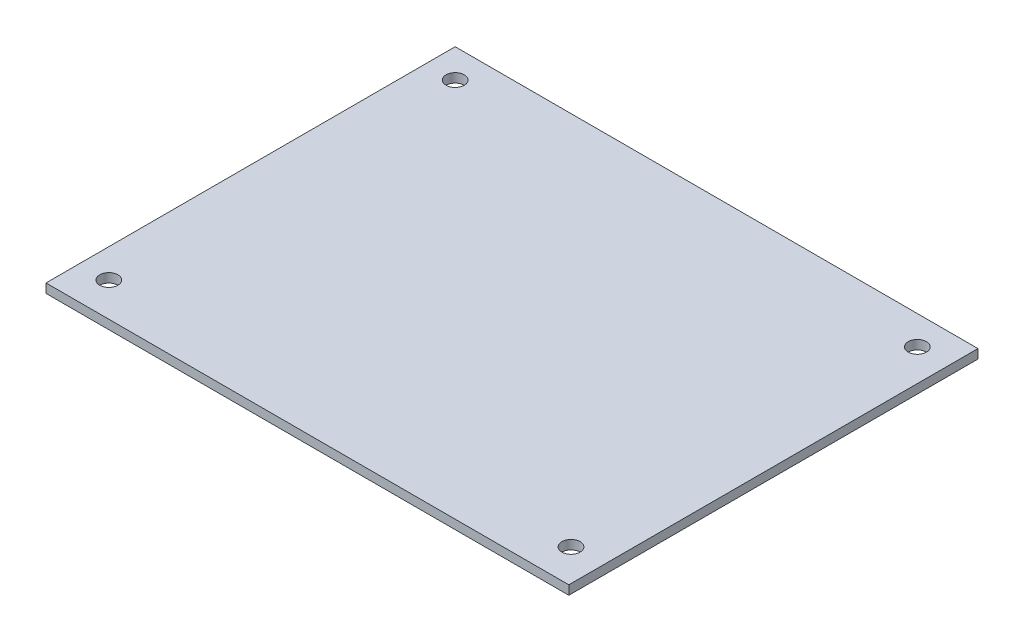
ISO-10303-21;
HEADER;
FILE_DESCRIPTION(('STEP AP214'),'2;1');
FILE_NAME('part.step','',(''),(''),'','','');
FILE_SCHEMA(('AUTOMOTIVE_DESIGN { 1 0 10303 214 1 1 1 1 }'));
ENDSEC;
DATA;
#1=APPLICATION_CONTEXT('core data for automotive mechanical design processes');
#2=APPLICATION_PROTOCOL_DEFINITION('international standard','automotive_design',2000,#1);
#3=PRODUCT_CONTEXT('',#1,'mechanical');
#4=PRODUCT('Part','Part','',(#3));
#5=PRODUCT_RELATED_PRODUCT_CATEGORY('part','',(#4));
#6=PRODUCT_DEFINITION_FORMATION('','',#4);
#7=PRODUCT_DEFINITION_CONTEXT('part definition',#1,'design');
#8=PRODUCT_DEFINITION('design','',#6,#7);
#9=PRODUCT_DEFINITION_SHAPE('','',#8);
#10=(LENGTH_UNIT() NAMED_UNIT(*) SI_UNIT(.MILLI.,.METRE.));
#11=(NAMED_UNIT(*) PLANE_ANGLE_UNIT() SI_UNIT($,.RADIAN.));
#12=(NAMED_UNIT(*) SI_UNIT($,.STERADIAN.) SOLID_ANGLE_UNIT());
#13=UNCERTAINTY_MEASURE_WITH_UNIT(LENGTH_MEASURE(1.E-05),#10,'distance_accuracy_value','');
#14=(GEOMETRIC_REPRESENTATION_CONTEXT(3) GLOBAL_UNCERTAINTY_ASSIGNED_CONTEXT((#13)) GLOBAL_UNIT_ASSIGNED_CONTEXT((#10,
#11,#12)) REPRESENTATION_CONTEXT('',''));
#15=CARTESIAN_POINT('',(0.,0.,0.));
#16=DIRECTION('',(0.,0.,1.));
#17=DIRECTION('',(1.,0.,0.));
#18=AXIS2_PLACEMENT_3D('',#15,#16,#17);
#19=CARTESIAN_POINT('',(0.,1.6,0.));
#20=DIRECTION('',(0.,-1.,0.));
#21=DIRECTION('',(0.,0.,-1.));
#22=AXIS2_PLACEMENT_3D('',#19,#20,#21);
#23=PLANE('',#22);
#24=DIRECTION('',(0.,0.,1.));
#25=VECTOR('',#24,1.);
#26=CARTESIAN_POINT('',(0.,1.6,0.));
#27=LINE('',#26,#25);
#28=CARTESIAN_POINT('',(0.,1.6,-72.));
#29=VERTEX_POINT('',#28);
#30=CARTESIAN_POINT('',(0.,1.6,0.));
#31=VERTEX_POINT('',#30);
#32=EDGE_CURVE('E84',#29,#31,#27,.T.);
#33=ORIENTED_EDGE('',*,*,#32,.T.);
#34=DIRECTION('',(1.,0.,0.));
#35=VECTOR('',#34,1.);
#36=CARTESIAN_POINT('',(0.,1.6,0.));
#37=LINE('',#36,#35);
#38=CARTESIAN_POINT('',(92.,1.6,0.));
#39=VERTEX_POINT('',#38);
#40=EDGE_CURVE('E79',#31,#39,#37,.T.);
#41=ORIENTED_EDGE('',*,*,#40,.T.);
#42=DIRECTION('',(0.,0.,-1.));
#43=VECTOR('',#42,1.);
#44=CARTESIAN_POINT('',(92.,1.6,0.));
#45=LINE('',#44,#43);
#46=CARTESIAN_POINT('',(92.,1.6,-72.));
#47=VERTEX_POINT('',#46);
#48=EDGE_CURVE('E82',#39,#47,#45,.T.);
#49=ORIENTED_EDGE('',*,*,#48,.T.);
#50=DIRECTION('',(-1.,0.,0.));
#51=VECTOR('',#50,1.);
#52=CARTESIAN_POINT('',(0.,1.6,-72.));
#53=LINE('',#52,#51);
#54=EDGE_CURVE('E49',#47,#29,#53,.T.);
#55=ORIENTED_EDGE('',*,*,#54,.T.);
#56=EDGE_LOOP('',(#33,#41,#49,#55));
#57=FACE_BOUND('',#56,.T.);
#58=CARTESIAN_POINT('',(5.08,1.6,-66.92));
#59=DIRECTION('',(0.,1.,0.));
#60=DIRECTION('',(0.,0.,1.));
#61=AXIS2_PLACEMENT_3D('',#58,#59,#60);
#62=CIRCLE('',#61,1.6);
#63=CARTESIAN_POINT('',(5.08,1.6,-65.32));
#64=VERTEX_POINT('',#63);
#65=EDGE_CURVE('E99',#64,#64,#62,.T.);
#66=ORIENTED_EDGE('',*,*,#65,.F.);
#67=EDGE_LOOP('',(#66));
#68=FACE_BOUND('',#67,.T.);
#69=CARTESIAN_POINT('',(86.412,1.6,-66.92));
#70=DIRECTION('',(0.,1.,0.));
#71=DIRECTION('',(0.,0.,1.));
#72=AXIS2_PLACEMENT_3D('',#69,#70,#71);
#73=CIRCLE('',#72,1.60000000000001);
#74=CARTESIAN_POINT('',(86.412,1.6,-65.32));
#75=VERTEX_POINT('',#74);
#76=EDGE_CURVE('E114',#75,#75,#73,.T.);
#77=ORIENTED_EDGE('',*,*,#76,.F.);
#78=EDGE_LOOP('',(#77));
#79=FACE_BOUND('',#78,.T.);
#80=CARTESIAN_POINT('',(86.412,1.6,-5.969));
#81=DIRECTION('',(0.,1.,0.));
#82=DIRECTION('',(0.,0.,1.));
#83=AXIS2_PLACEMENT_3D('',#80,#81,#82);
#84=CIRCLE('',#83,1.60000000000001);
#85=CARTESIAN_POINT('',(86.412,1.6,-4.369));
#86=VERTEX_POINT('',#85);
#87=EDGE_CURVE('E120',#86,#86,#84,.T.);
#88=ORIENTED_EDGE('',*,*,#87,.F.);
#89=EDGE_LOOP('',(#88));
#90=FACE_BOUND('',#89,.T.);
#91=CARTESIAN_POINT('',(5.08,1.6,-5.969));
#92=DIRECTION('',(0.,1.,0.));
#93=DIRECTION('',(0.,0.,1.));
#94=AXIS2_PLACEMENT_3D('',#91,#92,#93);
#95=CIRCLE('',#94,1.6);
#96=CARTESIAN_POINT('',(5.08,1.6,-4.369));
#97=VERTEX_POINT('',#96);
#98=EDGE_CURVE('E126',#97,#97,#95,.T.);
#99=ORIENTED_EDGE('',*,*,#98,.F.);
#100=EDGE_LOOP('',(#99));
#101=FACE_BOUND('',#100,.T.);
#102=ADVANCED_FACE('F32',(#57,#68,#79,#90,#101),#23,.F.);
#103=CARTESIAN_POINT('',(0.,0.,0.));
#104=DIRECTION('',(0.,-1.,0.));
#105=DIRECTION('',(0.,0.,-1.));
#106=AXIS2_PLACEMENT_3D('',#103,#104,#105);
#107=PLANE('',#106);
#108=CARTESIAN_POINT('',(86.412,0.,-5.969));
#109=DIRECTION('',(0.,1.,0.));
#110=DIRECTION('',(0.,0.,1.));
#111=AXIS2_PLACEMENT_3D('',#108,#109,#110);
#112=CIRCLE('',#111,1.60000000000001);
#113=CARTESIAN_POINT('',(86.412,0.,-4.369));
#114=VERTEX_POINT('',#113);
#115=EDGE_CURVE('E123',#114,#114,#112,.T.);
#116=ORIENTED_EDGE('',*,*,#115,.T.);
#117=EDGE_LOOP('',(#116));
#118=FACE_BOUND('',#117,.T.);
#119=CARTESIAN_POINT('',(5.08,0.,-66.92));
#120=DIRECTION('',(0.,1.,0.));
#121=DIRECTION('',(0.,0.,1.));
#122=AXIS2_PLACEMENT_3D('',#119,#120,#121);
#123=CIRCLE('',#122,1.6);
#124=CARTESIAN_POINT('',(5.08,0.,-65.32));
#125=VERTEX_POINT('',#124);
#126=EDGE_CURVE('E111',#125,#125,#123,.T.);
#127=ORIENTED_EDGE('',*,*,#126,.T.);
#128=EDGE_LOOP('',(#127));
#129=FACE_BOUND('',#128,.T.);
#130=DIRECTION('',(0.,0.,1.));
#131=VECTOR('',#130,1.);
#132=CARTESIAN_POINT('',(0.,0.,0.));
#133=LINE('',#132,#131);
#134=CARTESIAN_POINT('',(0.,0.,-72.));
#135=VERTEX_POINT('',#134);
#136=CARTESIAN_POINT('',(0.,0.,0.));
#137=VERTEX_POINT('',#136);
#138=EDGE_CURVE('E96',#135,#137,#133,.T.);
#139=ORIENTED_EDGE('',*,*,#138,.F.);
#140=DIRECTION('',(-1.,0.,0.));
#141=VECTOR('',#140,1.);
#142=CARTESIAN_POINT('',(0.,0.,-72.));
#143=LINE('',#142,#141);
#144=CARTESIAN_POINT('',(92.,0.,-72.));
#145=VERTEX_POINT('',#144);
#146=EDGE_CURVE('E72',#145,#135,#143,.T.);
#147=ORIENTED_EDGE('',*,*,#146,.F.);
#148=DIRECTION('',(0.,0.,-1.));
#149=VECTOR('',#148,1.);
#150=CARTESIAN_POINT('',(92.,0.,0.));
#151=LINE('',#150,#149);
#152=CARTESIAN_POINT('',(92.,0.,0.));
#153=VERTEX_POINT('',#152);
#154=EDGE_CURVE('E66',#153,#145,#151,.T.);
#155=ORIENTED_EDGE('',*,*,#154,.F.);
#156=DIRECTION('',(1.,0.,0.));
#157=VECTOR('',#156,1.);
#158=CARTESIAN_POINT('',(0.,0.,0.));
#159=LINE('',#158,#157);
#160=EDGE_CURVE('E88',#137,#153,#159,.T.);
#161=ORIENTED_EDGE('',*,*,#160,.F.);
#162=EDGE_LOOP('',(#139,#147,#155,#161));
#163=FACE_BOUND('',#162,.T.);
#164=CARTESIAN_POINT('',(86.412,0.,-66.92));
#165=DIRECTION('',(0.,1.,0.));
#166=DIRECTION('',(0.,0.,1.));
#167=AXIS2_PLACEMENT_3D('',#164,#165,#166);
#168=CIRCLE('',#167,1.60000000000001);
#169=CARTESIAN_POINT('',(86.412,0.,-65.32));
#170=VERTEX_POINT('',#169);
#171=EDGE_CURVE('E117',#170,#170,#168,.T.);
#172=ORIENTED_EDGE('',*,*,#171,.T.);
#173=EDGE_LOOP('',(#172));
#174=FACE_BOUND('',#173,.T.);
#175=CARTESIAN_POINT('',(5.08,0.,-5.969));
#176=DIRECTION('',(0.,1.,0.));
#177=DIRECTION('',(0.,0.,1.));
#178=AXIS2_PLACEMENT_3D('',#175,#176,#177);
#179=CIRCLE('',#178,1.6);
#180=CARTESIAN_POINT('',(5.08,0.,-4.369));
#181=VERTEX_POINT('',#180);
#182=EDGE_CURVE('E129',#181,#181,#179,.T.);
#183=ORIENTED_EDGE('',*,*,#182,.T.);
#184=EDGE_LOOP('',(#183));
#185=FACE_BOUND('',#184,.T.);
#186=ADVANCED_FACE('F107',(#118,#129,#163,#174,#185),#107,.T.);
#187=CARTESIAN_POINT('',(0.,1.6,0.));
#188=DIRECTION('',(1.,0.,0.));
#189=DIRECTION('',(0.,0.,-1.));
#190=AXIS2_PLACEMENT_3D('',#187,#188,#189);
#191=PLANE('',#190);
#192=ORIENTED_EDGE('',*,*,#138,.T.);
#193=DIRECTION('',(0.,-1.,0.));
#194=VECTOR('',#193,1.);
#195=CARTESIAN_POINT('',(0.,1.6,0.));
#196=LINE('',#195,#194);
#197=EDGE_CURVE('E11',#31,#137,#196,.T.);
#198=ORIENTED_EDGE('',*,*,#197,.F.);
#199=ORIENTED_EDGE('',*,*,#32,.F.);
#200=DIRECTION('',(0.,-1.,0.));
#201=VECTOR('',#200,1.);
#202=CARTESIAN_POINT('',(0.,1.6,-72.));
#203=LINE('',#202,#201);
#204=EDGE_CURVE('E92',#29,#135,#203,.T.);
#205=ORIENTED_EDGE('',*,*,#204,.T.);
#206=EDGE_LOOP('',(#192,#198,#199,#205));
#207=FACE_BOUND('',#206,.T.);
#208=ADVANCED_FACE('F34',(#207),#191,.F.);
#209=CARTESIAN_POINT('',(0.,1.6,0.));
#210=DIRECTION('',(0.,0.,-1.));
#211=DIRECTION('',(-1.,0.,0.));
#212=AXIS2_PLACEMENT_3D('',#209,#210,#211);
#213=PLANE('',#212);
#214=ORIENTED_EDGE('',*,*,#160,.T.);
#215=DIRECTION('',(0.,-1.,0.));
#216=VECTOR('',#215,1.);
#217=CARTESIAN_POINT('',(92.,1.6,0.));
#218=LINE('',#217,#216);
#219=EDGE_CURVE('E41',#39,#153,#218,.T.);
#220=ORIENTED_EDGE('',*,*,#219,.F.);
#221=ORIENTED_EDGE('',*,*,#40,.F.);
#222=ORIENTED_EDGE('',*,*,#197,.T.);
#223=EDGE_LOOP('',(#214,#220,#221,#222));
#224=FACE_BOUND('',#223,.T.);
#225=ADVANCED_FACE('F87',(#224),#213,.F.);
#226=CARTESIAN_POINT('',(92.,1.6,0.));
#227=DIRECTION('',(-1.,0.,0.));
#228=DIRECTION('',(0.,0.,1.));
#229=AXIS2_PLACEMENT_3D('',#226,#227,#228);
#230=PLANE('',#229);
#231=ORIENTED_EDGE('',*,*,#154,.T.);
#232=DIRECTION('',(0.,-1.,0.));
#233=VECTOR('',#232,1.);
#234=CARTESIAN_POINT('',(92.,1.6,-72.));
#235=LINE('',#234,#233);
#236=EDGE_CURVE('E89',#47,#145,#235,.T.);
#237=ORIENTED_EDGE('',*,*,#236,.F.);
#238=ORIENTED_EDGE('',*,*,#48,.F.);
#239=ORIENTED_EDGE('',*,*,#219,.T.);
#240=EDGE_LOOP('',(#231,#237,#238,#239));
#241=FACE_BOUND('',#240,.T.);
#242=ADVANCED_FACE('F90',(#241),#230,.F.);
#243=CARTESIAN_POINT('',(0.,1.6,-72.));
#244=DIRECTION('',(0.,0.,1.));
#245=DIRECTION('',(1.,0.,0.));
#246=AXIS2_PLACEMENT_3D('',#243,#244,#245);
#247=PLANE('',#246);
#248=ORIENTED_EDGE('',*,*,#146,.T.);
#249=ORIENTED_EDGE('',*,*,#204,.F.);
#250=ORIENTED_EDGE('',*,*,#54,.F.);
#251=ORIENTED_EDGE('',*,*,#236,.T.);
#252=EDGE_LOOP('',(#248,#249,#250,#251));
#253=FACE_BOUND('',#252,.T.);
#254=ADVANCED_FACE('F104',(#253),#247,.F.);
#255=CARTESIAN_POINT('',(5.08,1.6,-66.92));
#256=DIRECTION('',(0.,-1.,0.));
#257=DIRECTION('',(0.,0.,-1.));
#258=AXIS2_PLACEMENT_3D('',#255,#256,#257);
#259=CYLINDRICAL_SURFACE('',#258,1.6);
#260=ORIENTED_EDGE('',*,*,#65,.T.);
#261=EDGE_LOOP('',(#260));
#262=FACE_BOUND('',#261,.T.);
#263=ORIENTED_EDGE('',*,*,#126,.F.);
#264=EDGE_LOOP('',(#263));
#265=FACE_BOUND('',#264,.T.);
#266=ADVANCED_FACE('F146',(#262,#265),#259,.F.);
#267=CARTESIAN_POINT('',(86.412,1.6,-66.92));
#268=DIRECTION('',(0.,-1.,0.));
#269=DIRECTION('',(0.,0.,-1.));
#270=AXIS2_PLACEMENT_3D('',#267,#268,#269);
#271=CYLINDRICAL_SURFACE('',#270,1.60000000000001);
#272=ORIENTED_EDGE('',*,*,#76,.T.);
#273=EDGE_LOOP('',(#272));
#274=FACE_BOUND('',#273,.T.);
#275=ORIENTED_EDGE('',*,*,#171,.F.);
#276=EDGE_LOOP('',(#275));
#277=FACE_BOUND('',#276,.T.);
#278=ADVANCED_FACE('F192',(#274,#277),#271,.F.);
#279=CARTESIAN_POINT('',(86.412,1.6,-5.969));
#280=DIRECTION('',(0.,-1.,0.));
#281=DIRECTION('',(0.,0.,-1.));
#282=AXIS2_PLACEMENT_3D('',#279,#280,#281);
#283=CYLINDRICAL_SURFACE('',#282,1.60000000000001);
#284=ORIENTED_EDGE('',*,*,#87,.T.);
#285=EDGE_LOOP('',(#284));
#286=FACE_BOUND('',#285,.T.);
#287=ORIENTED_EDGE('',*,*,#115,.F.);
#288=EDGE_LOOP('',(#287));
#289=FACE_BOUND('',#288,.T.);
#290=ADVANCED_FACE('F200',(#286,#289),#283,.F.);
#291=CARTESIAN_POINT('',(5.08,1.6,-5.969));
#292=DIRECTION('',(0.,-1.,0.));
#293=DIRECTION('',(0.,0.,-1.));
#294=AXIS2_PLACEMENT_3D('',#291,#292,#293);
#295=CYLINDRICAL_SURFACE('',#294,1.6);
#296=ORIENTED_EDGE('',*,*,#98,.T.);
#297=EDGE_LOOP('',(#296));
#298=FACE_BOUND('',#297,.T.);
#299=ORIENTED_EDGE('',*,*,#182,.F.);
#300=EDGE_LOOP('',(#299));
#301=FACE_BOUND('',#300,.T.);
#302=ADVANCED_FACE('F135',(#298,#301),#295,.F.);
#303=CLOSED_SHELL('',(#102,#186,#208,#225,#242,#254,#266,#278,#290,#302));
#304=MANIFOLD_SOLID_BREP('B2',#303);
#305=ADVANCED_BREP_SHAPE_REPRESENTATION('',(#18,#304),#14);
#306=SHAPE_DEFINITION_REPRESENTATION(#9,#305);
ENDSEC;
END-ISO-10303-21;
